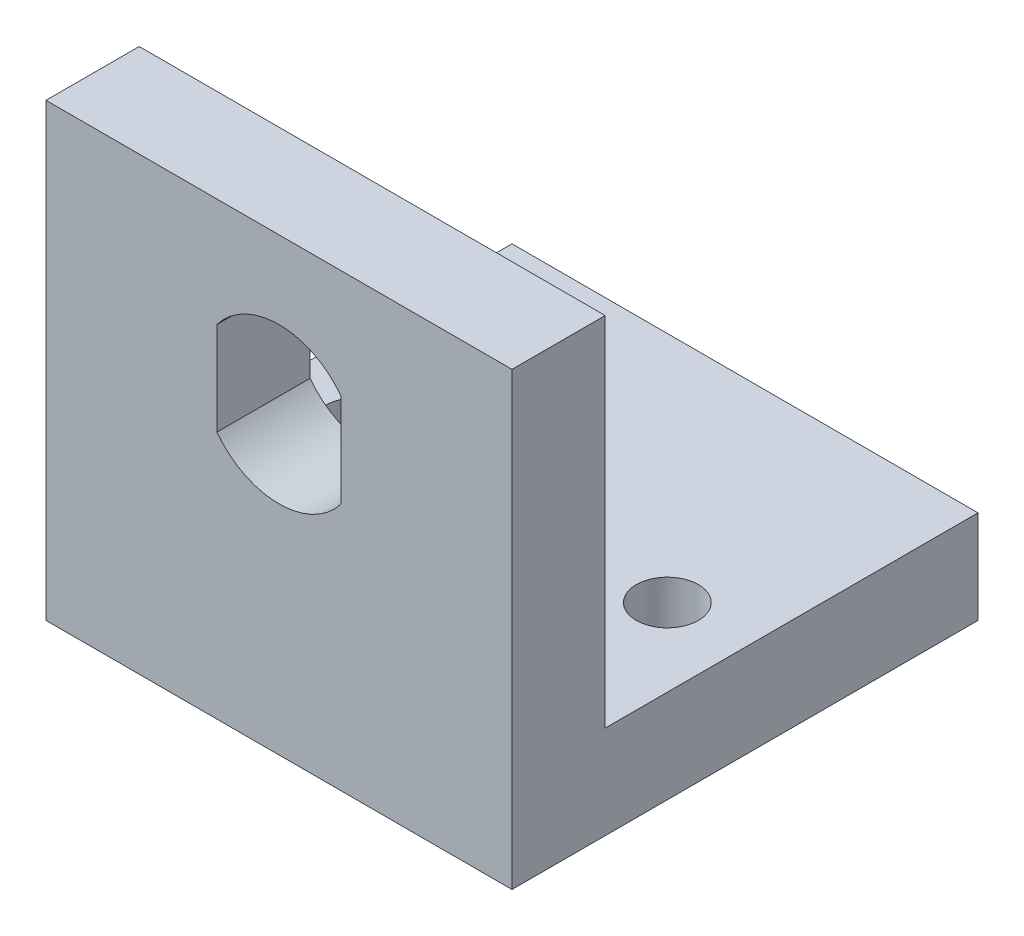
ISO-10303-21;
HEADER;
FILE_DESCRIPTION(('STEP AP214'),'2;1');
FILE_NAME('part.step','',(''),(''),'','','');
FILE_SCHEMA(('AUTOMOTIVE_DESIGN { 1 0 10303 214 1 1 1 1 }'));
ENDSEC;
DATA;
#1=APPLICATION_CONTEXT('core data for automotive mechanical design processes');
#2=APPLICATION_PROTOCOL_DEFINITION('international standard','automotive_design',2000,#1);
#3=PRODUCT_CONTEXT('',#1,'mechanical');
#4=PRODUCT('Part','Part','',(#3));
#5=PRODUCT_RELATED_PRODUCT_CATEGORY('part','',(#4));
#6=PRODUCT_DEFINITION_FORMATION('','',#4);
#7=PRODUCT_DEFINITION_CONTEXT('part definition',#1,'design');
#8=PRODUCT_DEFINITION('design','',#6,#7);
#9=PRODUCT_DEFINITION_SHAPE('','',#8);
#10=(LENGTH_UNIT() NAMED_UNIT(*) SI_UNIT(.MILLI.,.METRE.));
#11=(NAMED_UNIT(*) PLANE_ANGLE_UNIT() SI_UNIT($,.RADIAN.));
#12=(NAMED_UNIT(*) SI_UNIT($,.STERADIAN.) SOLID_ANGLE_UNIT());
#13=UNCERTAINTY_MEASURE_WITH_UNIT(LENGTH_MEASURE(1.E-05),#10,'distance_accuracy_value','');
#14=(GEOMETRIC_REPRESENTATION_CONTEXT(3) GLOBAL_UNCERTAINTY_ASSIGNED_CONTEXT((#13)) GLOBAL_UNIT_ASSIGNED_CONTEXT((#10,
#11,#12)) REPRESENTATION_CONTEXT('',''));
#15=CARTESIAN_POINT('',(0.,0.,0.));
#16=DIRECTION('',(0.,0.,1.));
#17=DIRECTION('',(1.,0.,0.));
#18=AXIS2_PLACEMENT_3D('',#15,#16,#17);
#19=CARTESIAN_POINT('',(15.,0.,-30.));
#20=DIRECTION('',(0.,1.,0.));
#21=DIRECTION('',(0.,0.,1.));
#22=AXIS2_PLACEMENT_3D('',#19,#20,#21);
#23=PLANE('',#22);
#24=CARTESIAN_POINT('',(-10.,0.,-15.));
#25=DIRECTION('',(0.,1.,0.));
#26=DIRECTION('',(0.,0.,1.));
#27=AXIS2_PLACEMENT_3D('',#24,#25,#26);
#28=CIRCLE('',#27,2.);
#29=CARTESIAN_POINT('',(-10.,0.,-13.));
#30=VERTEX_POINT('',#29);
#31=EDGE_CURVE('E150',#30,#30,#28,.T.);
#32=ORIENTED_EDGE('',*,*,#31,.T.);
#33=EDGE_LOOP('',(#32));
#34=FACE_BOUND('',#33,.T.);
#35=CARTESIAN_POINT('',(10.,0.,-15.));
#36=DIRECTION('',(0.,1.,0.));
#37=DIRECTION('',(0.,0.,1.));
#38=AXIS2_PLACEMENT_3D('',#35,#36,#37);
#39=CIRCLE('',#38,2.);
#40=CARTESIAN_POINT('',(10.,0.,-13.));
#41=VERTEX_POINT('',#40);
#42=EDGE_CURVE('E149',#41,#41,#39,.T.);
#43=ORIENTED_EDGE('',*,*,#42,.T.);
#44=EDGE_LOOP('',(#43));
#45=FACE_BOUND('',#44,.T.);
#46=DIRECTION('',(0.,0.,-1.));
#47=VECTOR('',#46,1.);
#48=CARTESIAN_POINT('',(-15.,0.,-30.));
#49=LINE('',#48,#47);
#50=CARTESIAN_POINT('',(-15.,0.,0.));
#51=VERTEX_POINT('',#50);
#52=CARTESIAN_POINT('',(-15.,0.,-30.));
#53=VERTEX_POINT('',#52);
#54=EDGE_CURVE('E171',#51,#53,#49,.T.);
#55=ORIENTED_EDGE('',*,*,#54,.T.);
#56=DIRECTION('',(-1.,0.,0.));
#57=VECTOR('',#56,1.);
#58=CARTESIAN_POINT('',(15.,0.,-30.));
#59=LINE('',#58,#57);
#60=CARTESIAN_POINT('',(15.,0.,-30.));
#61=VERTEX_POINT('',#60);
#62=EDGE_CURVE('E11',#61,#53,#59,.T.);
#63=ORIENTED_EDGE('',*,*,#62,.F.);
#64=DIRECTION('',(0.,0.,-1.));
#65=VECTOR('',#64,1.);
#66=CARTESIAN_POINT('',(15.,0.,-30.));
#67=LINE('',#66,#65);
#68=CARTESIAN_POINT('',(15.,0.,0.));
#69=VERTEX_POINT('',#68);
#70=EDGE_CURVE('E156',#69,#61,#67,.T.);
#71=ORIENTED_EDGE('',*,*,#70,.F.);
#72=DIRECTION('',(-1.,0.,0.));
#73=VECTOR('',#72,1.);
#74=CARTESIAN_POINT('',(15.,0.,0.));
#75=LINE('',#74,#73);
#76=EDGE_CURVE('E170',#69,#51,#75,.T.);
#77=ORIENTED_EDGE('',*,*,#76,.T.);
#78=EDGE_LOOP('',(#55,#63,#71,#77));
#79=FACE_BOUND('',#78,.T.);
#80=ADVANCED_FACE('F34',(#34,#45,#79),#23,.F.);
#81=CARTESIAN_POINT('',(15.,6.,-30.));
#82=DIRECTION('',(0.,0.,1.));
#83=DIRECTION('',(1.,0.,0.));
#84=AXIS2_PLACEMENT_3D('',#81,#82,#83);
#85=PLANE('',#84);
#86=DIRECTION('',(0.,1.,0.));
#87=VECTOR('',#86,1.);
#88=CARTESIAN_POINT('',(-15.,6.,-30.));
#89=LINE('',#88,#87);
#90=CARTESIAN_POINT('',(-15.,6.,-30.));
#91=VERTEX_POINT('',#90);
#92=EDGE_CURVE('E174',#53,#91,#89,.T.);
#93=ORIENTED_EDGE('',*,*,#92,.T.);
#94=DIRECTION('',(-1.,0.,0.));
#95=VECTOR('',#94,1.);
#96=CARTESIAN_POINT('',(15.,6.,-30.));
#97=LINE('',#96,#95);
#98=CARTESIAN_POINT('',(15.,6.,-30.));
#99=VERTEX_POINT('',#98);
#100=EDGE_CURVE('E42',#99,#91,#97,.T.);
#101=ORIENTED_EDGE('',*,*,#100,.F.);
#102=DIRECTION('',(0.,1.,0.));
#103=VECTOR('',#102,1.);
#104=CARTESIAN_POINT('',(15.,6.,-30.));
#105=LINE('',#104,#103);
#106=EDGE_CURVE('E159',#61,#99,#105,.T.);
#107=ORIENTED_EDGE('',*,*,#106,.F.);
#108=ORIENTED_EDGE('',*,*,#62,.T.);
#109=EDGE_LOOP('',(#93,#101,#107,#108));
#110=FACE_BOUND('',#109,.T.);
#111=ADVANCED_FACE('F207',(#110),#85,.F.);
#112=CARTESIAN_POINT('',(15.,6.,-6.));
#113=DIRECTION('',(0.,-1.,0.));
#114=DIRECTION('',(0.,0.,-1.));
#115=AXIS2_PLACEMENT_3D('',#112,#113,#114);
#116=PLANE('',#115);
#117=CARTESIAN_POINT('',(-10.,6.,-15.));
#118=DIRECTION('',(0.,-1.,0.));
#119=DIRECTION('',(0.,0.,-1.));
#120=AXIS2_PLACEMENT_3D('',#117,#118,#119);
#121=CIRCLE('',#120,2.);
#122=CARTESIAN_POINT('',(-10.,6.,-17.));
#123=VERTEX_POINT('',#122);
#124=EDGE_CURVE('E37',#123,#123,#121,.F.);
#125=ORIENTED_EDGE('',*,*,#124,.F.);
#126=EDGE_LOOP('',(#125));
#127=FACE_BOUND('',#126,.T.);
#128=CARTESIAN_POINT('',(10.,6.,-15.));
#129=DIRECTION('',(0.,-1.,0.));
#130=DIRECTION('',(0.,0.,-1.));
#131=AXIS2_PLACEMENT_3D('',#128,#129,#130);
#132=CIRCLE('',#131,2.);
#133=CARTESIAN_POINT('',(10.,6.,-17.));
#134=VERTEX_POINT('',#133);
#135=EDGE_CURVE('E153',#134,#134,#132,.F.);
#136=ORIENTED_EDGE('',*,*,#135,.F.);
#137=EDGE_LOOP('',(#136));
#138=FACE_BOUND('',#137,.T.);
#139=DIRECTION('',(0.,0.,1.));
#140=VECTOR('',#139,1.);
#141=CARTESIAN_POINT('',(-15.,6.,-6.));
#142=LINE('',#141,#140);
#143=CARTESIAN_POINT('',(-15.,6.,-6.));
#144=VERTEX_POINT('',#143);
#145=EDGE_CURVE('E176',#91,#144,#142,.T.);
#146=ORIENTED_EDGE('',*,*,#145,.T.);
#147=DIRECTION('',(-1.,0.,0.));
#148=VECTOR('',#147,1.);
#149=CARTESIAN_POINT('',(15.,6.,-6.));
#150=LINE('',#149,#148);
#151=CARTESIAN_POINT('',(15.,6.,-6.));
#152=VERTEX_POINT('',#151);
#153=EDGE_CURVE('E191',#152,#144,#150,.T.);
#154=ORIENTED_EDGE('',*,*,#153,.F.);
#155=DIRECTION('',(0.,0.,1.));
#156=VECTOR('',#155,1.);
#157=CARTESIAN_POINT('',(15.,6.,-6.));
#158=LINE('',#157,#156);
#159=EDGE_CURVE('E162',#99,#152,#158,.T.);
#160=ORIENTED_EDGE('',*,*,#159,.F.);
#161=ORIENTED_EDGE('',*,*,#100,.T.);
#162=EDGE_LOOP('',(#146,#154,#160,#161));
#163=FACE_BOUND('',#162,.T.);
#164=ADVANCED_FACE('F203',(#127,#138,#163),#116,.F.);
#165=CARTESIAN_POINT('',(15.,29.,-6.));
#166=DIRECTION('',(0.,0.,1.));
#167=DIRECTION('',(0.,-1.,0.));
#168=AXIS2_PLACEMENT_3D('',#165,#166,#167);
#169=PLANE('',#168);
#170=DIRECTION('',(0.,1.,0.));
#171=VECTOR('',#170,1.);
#172=CARTESIAN_POINT('',(4.,29.,-6.));
#173=LINE('',#172,#171);
#174=CARTESIAN_POINT('',(4.,16.,-6.));
#175=VERTEX_POINT('',#174);
#176=CARTESIAN_POINT('',(4.,22.,-6.));
#177=VERTEX_POINT('',#176);
#178=EDGE_CURVE('E143',#175,#177,#173,.T.);
#179=ORIENTED_EDGE('',*,*,#178,.T.);
#180=CARTESIAN_POINT('',(0.,19.,-6.));
#181=DIRECTION('',(0.,0.,1.));
#182=DIRECTION('',(0.,-1.,0.));
#183=AXIS2_PLACEMENT_3D('',#180,#181,#182);
#184=CIRCLE('',#183,5.);
#185=CARTESIAN_POINT('',(-4.,22.,-6.));
#186=VERTEX_POINT('',#185);
#187=EDGE_CURVE('E146',#177,#186,#184,.T.);
#188=ORIENTED_EDGE('',*,*,#187,.T.);
#189=DIRECTION('',(0.,-1.,0.));
#190=VECTOR('',#189,1.);
#191=CARTESIAN_POINT('',(-4.,29.,-6.));
#192=LINE('',#191,#190);
#193=CARTESIAN_POINT('',(-4.,16.,-6.));
#194=VERTEX_POINT('',#193);
#195=EDGE_CURVE('E138',#186,#194,#192,.T.);
#196=ORIENTED_EDGE('',*,*,#195,.T.);
#197=CARTESIAN_POINT('',(0.,19.,-6.));
#198=DIRECTION('',(0.,0.,1.));
#199=DIRECTION('',(0.,-1.,0.));
#200=AXIS2_PLACEMENT_3D('',#197,#198,#199);
#201=CIRCLE('',#200,5.);
#202=EDGE_CURVE('E118',#194,#175,#201,.T.);
#203=ORIENTED_EDGE('',*,*,#202,.T.);
#204=EDGE_LOOP('',(#179,#188,#196,#203));
#205=FACE_BOUND('',#204,.T.);
#206=DIRECTION('',(0.,1.,0.));
#207=VECTOR('',#206,1.);
#208=CARTESIAN_POINT('',(-15.,29.,-6.));
#209=LINE('',#208,#207);
#210=CARTESIAN_POINT('',(-15.,29.,-6.));
#211=VERTEX_POINT('',#210);
#212=EDGE_CURVE('E178',#144,#211,#209,.T.);
#213=ORIENTED_EDGE('',*,*,#212,.T.);
#214=DIRECTION('',(-1.,0.,0.));
#215=VECTOR('',#214,1.);
#216=CARTESIAN_POINT('',(15.,29.,-6.));
#217=LINE('',#216,#215);
#218=CARTESIAN_POINT('',(15.,29.,-6.));
#219=VERTEX_POINT('',#218);
#220=EDGE_CURVE('E188',#219,#211,#217,.T.);
#221=ORIENTED_EDGE('',*,*,#220,.F.);
#222=DIRECTION('',(0.,1.,0.));
#223=VECTOR('',#222,1.);
#224=CARTESIAN_POINT('',(15.,29.,-6.));
#225=LINE('',#224,#223);
#226=EDGE_CURVE('E164',#152,#219,#225,.T.);
#227=ORIENTED_EDGE('',*,*,#226,.F.);
#228=ORIENTED_EDGE('',*,*,#153,.T.);
#229=EDGE_LOOP('',(#213,#221,#227,#228));
#230=FACE_BOUND('',#229,.T.);
#231=ADVANCED_FACE('F206',(#205,#230),#169,.F.);
#232=CARTESIAN_POINT('',(15.,29.,0.));
#233=DIRECTION('',(0.,-1.,0.));
#234=DIRECTION('',(0.,0.,-1.));
#235=AXIS2_PLACEMENT_3D('',#232,#233,#234);
#236=PLANE('',#235);
#237=DIRECTION('',(0.,0.,1.));
#238=VECTOR('',#237,1.);
#239=CARTESIAN_POINT('',(-15.,29.,0.));
#240=LINE('',#239,#238);
#241=CARTESIAN_POINT('',(-15.,29.,0.));
#242=VERTEX_POINT('',#241);
#243=EDGE_CURVE('E180',#211,#242,#240,.T.);
#244=ORIENTED_EDGE('',*,*,#243,.T.);
#245=DIRECTION('',(-1.,0.,0.));
#246=VECTOR('',#245,1.);
#247=CARTESIAN_POINT('',(15.,29.,0.));
#248=LINE('',#247,#246);
#249=CARTESIAN_POINT('',(15.,29.,0.));
#250=VERTEX_POINT('',#249);
#251=EDGE_CURVE('E185',#250,#242,#248,.T.);
#252=ORIENTED_EDGE('',*,*,#251,.F.);
#253=DIRECTION('',(0.,0.,1.));
#254=VECTOR('',#253,1.);
#255=CARTESIAN_POINT('',(15.,29.,0.));
#256=LINE('',#255,#254);
#257=EDGE_CURVE('E166',#219,#250,#256,.T.);
#258=ORIENTED_EDGE('',*,*,#257,.F.);
#259=ORIENTED_EDGE('',*,*,#220,.T.);
#260=EDGE_LOOP('',(#244,#252,#258,#259));
#261=FACE_BOUND('',#260,.T.);
#262=ADVANCED_FACE('F225',(#261),#236,.F.);
#263=CARTESIAN_POINT('',(15.,0.,0.));
#264=DIRECTION('',(0.,0.,-1.));
#265=DIRECTION('',(-1.,0.,0.));
#266=AXIS2_PLACEMENT_3D('',#263,#264,#265);
#267=PLANE('',#266);
#268=DIRECTION('',(0.,-1.,0.));
#269=VECTOR('',#268,1.);
#270=CARTESIAN_POINT('',(-4.,22.,0.));
#271=LINE('',#270,#269);
#272=CARTESIAN_POINT('',(-4.,22.,0.));
#273=VERTEX_POINT('',#272);
#274=CARTESIAN_POINT('',(-4.,16.,0.));
#275=VERTEX_POINT('',#274);
#276=EDGE_CURVE('E124',#273,#275,#271,.T.);
#277=ORIENTED_EDGE('',*,*,#276,.F.);
#278=CARTESIAN_POINT('',(0.,19.,0.));
#279=DIRECTION('',(0.,0.,1.));
#280=DIRECTION('',(1.,0.,0.));
#281=AXIS2_PLACEMENT_3D('',#278,#279,#280);
#282=CIRCLE('',#281,5.);
#283=CARTESIAN_POINT('',(4.,22.,0.));
#284=VERTEX_POINT('',#283);
#285=EDGE_CURVE('E58',#284,#273,#282,.T.);
#286=ORIENTED_EDGE('',*,*,#285,.F.);
#287=DIRECTION('',(0.,1.,0.));
#288=VECTOR('',#287,1.);
#289=CARTESIAN_POINT('',(4.,22.,0.));
#290=LINE('',#289,#288);
#291=CARTESIAN_POINT('',(4.,16.,0.));
#292=VERTEX_POINT('',#291);
#293=EDGE_CURVE('E131',#292,#284,#290,.T.);
#294=ORIENTED_EDGE('',*,*,#293,.F.);
#295=CARTESIAN_POINT('',(0.,19.,0.));
#296=DIRECTION('',(0.,0.,1.));
#297=DIRECTION('',(1.,0.,0.));
#298=AXIS2_PLACEMENT_3D('',#295,#296,#297);
#299=CIRCLE('',#298,5.);
#300=EDGE_CURVE('E115',#275,#292,#299,.T.);
#301=ORIENTED_EDGE('',*,*,#300,.F.);
#302=EDGE_LOOP('',(#277,#286,#294,#301));
#303=FACE_BOUND('',#302,.T.);
#304=DIRECTION('',(0.,-1.,0.));
#305=VECTOR('',#304,1.);
#306=CARTESIAN_POINT('',(-15.,0.,0.));
#307=LINE('',#306,#305);
#308=EDGE_CURVE('E160',#242,#51,#307,.T.);
#309=ORIENTED_EDGE('',*,*,#308,.T.);
#310=ORIENTED_EDGE('',*,*,#76,.F.);
#311=DIRECTION('',(0.,-1.,0.));
#312=VECTOR('',#311,1.);
#313=CARTESIAN_POINT('',(15.,0.,0.));
#314=LINE('',#313,#312);
#315=EDGE_CURVE('E168',#250,#69,#314,.T.);
#316=ORIENTED_EDGE('',*,*,#315,.F.);
#317=ORIENTED_EDGE('',*,*,#251,.T.);
#318=EDGE_LOOP('',(#309,#310,#316,#317));
#319=FACE_BOUND('',#318,.T.);
#320=ADVANCED_FACE('F128',(#303,#319),#267,.F.);
#321=CARTESIAN_POINT('',(15.,0.,0.));
#322=DIRECTION('',(-1.,0.,0.));
#323=DIRECTION('',(0.,0.,1.));
#324=AXIS2_PLACEMENT_3D('',#321,#322,#323);
#325=PLANE('',#324);
#326=ORIENTED_EDGE('',*,*,#70,.T.);
#327=ORIENTED_EDGE('',*,*,#106,.T.);
#328=ORIENTED_EDGE('',*,*,#159,.T.);
#329=ORIENTED_EDGE('',*,*,#226,.T.);
#330=ORIENTED_EDGE('',*,*,#257,.T.);
#331=ORIENTED_EDGE('',*,*,#315,.T.);
#332=EDGE_LOOP('',(#326,#327,#328,#329,#330,#331));
#333=FACE_BOUND('',#332,.T.);
#334=ADVANCED_FACE('F231',(#333),#325,.F.);
#335=CARTESIAN_POINT('',(-15.,0.,0.));
#336=DIRECTION('',(-1.,0.,0.));
#337=DIRECTION('',(0.,0.,1.));
#338=AXIS2_PLACEMENT_3D('',#335,#336,#337);
#339=PLANE('',#338);
#340=ORIENTED_EDGE('',*,*,#54,.F.);
#341=ORIENTED_EDGE('',*,*,#308,.F.);
#342=ORIENTED_EDGE('',*,*,#243,.F.);
#343=ORIENTED_EDGE('',*,*,#212,.F.);
#344=ORIENTED_EDGE('',*,*,#145,.F.);
#345=ORIENTED_EDGE('',*,*,#92,.F.);
#346=EDGE_LOOP('',(#340,#341,#342,#343,#344,#345));
#347=FACE_BOUND('',#346,.T.);
#348=ADVANCED_FACE('F221',(#347),#339,.T.);
#349=CARTESIAN_POINT('',(10.,40.,-15.));
#350=DIRECTION('',(0.,-1.,0.));
#351=DIRECTION('',(0.,0.,-1.));
#352=AXIS2_PLACEMENT_3D('',#349,#350,#351);
#353=CYLINDRICAL_SURFACE('',#352,2.);
#354=ORIENTED_EDGE('',*,*,#42,.F.);
#355=EDGE_LOOP('',(#354));
#356=FACE_BOUND('',#355,.T.);
#357=ORIENTED_EDGE('',*,*,#135,.T.);
#358=EDGE_LOOP('',(#357));
#359=FACE_BOUND('',#358,.T.);
#360=ADVANCED_FACE('F244',(#356,#359),#353,.F.);
#361=CARTESIAN_POINT('',(-10.,40.,-15.));
#362=DIRECTION('',(0.,-1.,0.));
#363=DIRECTION('',(0.,0.,-1.));
#364=AXIS2_PLACEMENT_3D('',#361,#362,#363);
#365=CYLINDRICAL_SURFACE('',#364,2.);
#366=ORIENTED_EDGE('',*,*,#31,.F.);
#367=EDGE_LOOP('',(#366));
#368=FACE_BOUND('',#367,.T.);
#369=ORIENTED_EDGE('',*,*,#124,.T.);
#370=EDGE_LOOP('',(#369));
#371=FACE_BOUND('',#370,.T.);
#372=ADVANCED_FACE('F201',(#368,#371),#365,.F.);
#373=CARTESIAN_POINT('',(0.,19.,-40.));
#374=DIRECTION('',(0.,0.,1.));
#375=DIRECTION('',(1.,0.,0.));
#376=AXIS2_PLACEMENT_3D('',#373,#374,#375);
#377=CYLINDRICAL_SURFACE('',#376,5.);
#378=DIRECTION('',(0.,0.,1.));
#379=VECTOR('',#378,1.);
#380=CARTESIAN_POINT('',(4.,22.,-40.));
#381=LINE('',#380,#379);
#382=EDGE_CURVE('E136',#177,#284,#381,.T.);
#383=ORIENTED_EDGE('',*,*,#382,.T.);
#384=ORIENTED_EDGE('',*,*,#285,.T.);
#385=DIRECTION('',(0.,0.,1.));
#386=VECTOR('',#385,1.);
#387=CARTESIAN_POINT('',(-4.,22.,-40.));
#388=LINE('',#387,#386);
#389=EDGE_CURVE('E121',#186,#273,#388,.T.);
#390=ORIENTED_EDGE('',*,*,#389,.F.);
#391=ORIENTED_EDGE('',*,*,#187,.F.);
#392=EDGE_LOOP('',(#383,#384,#390,#391));
#393=FACE_BOUND('',#392,.T.);
#394=ADVANCED_FACE('F251',(#393),#377,.F.);
#395=CARTESIAN_POINT('',(4.,22.,-40.));
#396=DIRECTION('',(1.,0.,0.));
#397=DIRECTION('',(0.,1.,0.));
#398=AXIS2_PLACEMENT_3D('',#395,#396,#397);
#399=PLANE('',#398);
#400=DIRECTION('',(0.,0.,1.));
#401=VECTOR('',#400,1.);
#402=CARTESIAN_POINT('',(4.,16.,-40.));
#403=LINE('',#402,#401);
#404=EDGE_CURVE('E120',#175,#292,#403,.T.);
#405=ORIENTED_EDGE('',*,*,#404,.T.);
#406=ORIENTED_EDGE('',*,*,#293,.T.);
#407=ORIENTED_EDGE('',*,*,#382,.F.);
#408=ORIENTED_EDGE('',*,*,#178,.F.);
#409=EDGE_LOOP('',(#405,#406,#407,#408));
#410=FACE_BOUND('',#409,.T.);
#411=ADVANCED_FACE('F269',(#410),#399,.F.);
#412=CARTESIAN_POINT('',(0.,19.,-40.));
#413=DIRECTION('',(0.,0.,1.));
#414=DIRECTION('',(1.,0.,0.));
#415=AXIS2_PLACEMENT_3D('',#412,#413,#414);
#416=CYLINDRICAL_SURFACE('',#415,5.);
#417=DIRECTION('',(0.,0.,1.));
#418=VECTOR('',#417,1.);
#419=CARTESIAN_POINT('',(-4.,16.,-40.));
#420=LINE('',#419,#418);
#421=EDGE_CURVE('E50',#194,#275,#420,.T.);
#422=ORIENTED_EDGE('',*,*,#421,.T.);
#423=ORIENTED_EDGE('',*,*,#300,.T.);
#424=ORIENTED_EDGE('',*,*,#404,.F.);
#425=ORIENTED_EDGE('',*,*,#202,.F.);
#426=EDGE_LOOP('',(#422,#423,#424,#425));
#427=FACE_BOUND('',#426,.T.);
#428=ADVANCED_FACE('F112',(#427),#416,.F.);
#429=CARTESIAN_POINT('',(-4.,22.,-40.));
#430=DIRECTION('',(-1.,0.,0.));
#431=DIRECTION('',(0.,0.,1.));
#432=AXIS2_PLACEMENT_3D('',#429,#430,#431);
#433=PLANE('',#432);
#434=ORIENTED_EDGE('',*,*,#389,.T.);
#435=ORIENTED_EDGE('',*,*,#276,.T.);
#436=ORIENTED_EDGE('',*,*,#421,.F.);
#437=ORIENTED_EDGE('',*,*,#195,.F.);
#438=EDGE_LOOP('',(#434,#435,#436,#437));
#439=FACE_BOUND('',#438,.T.);
#440=ADVANCED_FACE('F125',(#439),#433,.F.);
#441=CLOSED_SHELL('',(#80,#111,#164,#231,#262,#320,#334,#348,#360,#372,#394,#411,#428,#440));
#442=MANIFOLD_SOLID_BREP('B2',#441);
#443=ADVANCED_BREP_SHAPE_REPRESENTATION('',(#18,#442),#14);
#444=SHAPE_DEFINITION_REPRESENTATION(#9,#443);
ENDSEC;
END-ISO-10303-21;
